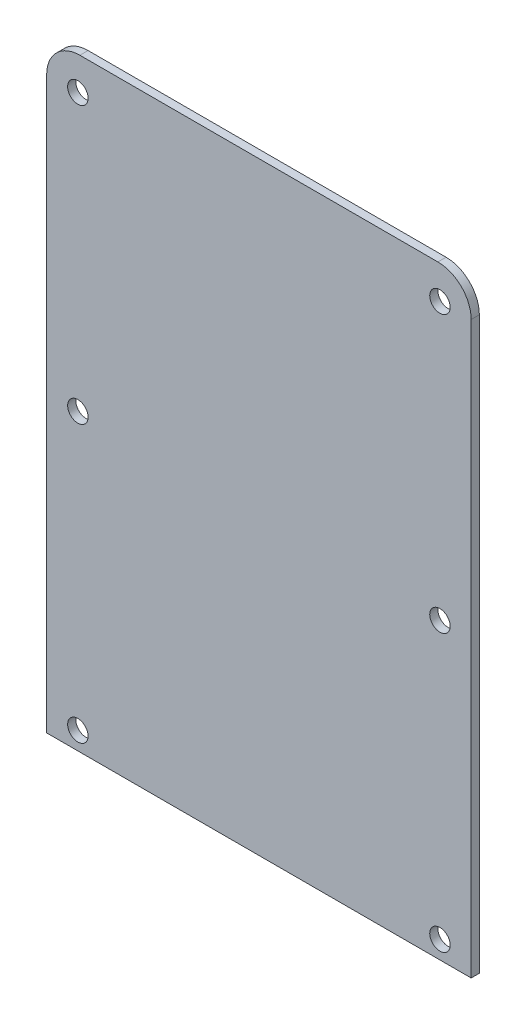
ISO-10303-21;
HEADER;
FILE_DESCRIPTION(('STEP AP214'),'2;1');
FILE_NAME('part.step','',(''),(''),'','','');
FILE_SCHEMA(('AUTOMOTIVE_DESIGN { 1 0 10303 214 1 1 1 1 }'));
ENDSEC;
DATA;
#1=APPLICATION_CONTEXT('core data for automotive mechanical design processes');
#2=APPLICATION_PROTOCOL_DEFINITION('international standard','automotive_design',2000,#1);
#3=PRODUCT_CONTEXT('',#1,'mechanical');
#4=PRODUCT('Part','Part','',(#3));
#5=PRODUCT_RELATED_PRODUCT_CATEGORY('part','',(#4));
#6=PRODUCT_DEFINITION_FORMATION('','',#4);
#7=PRODUCT_DEFINITION_CONTEXT('part definition',#1,'design');
#8=PRODUCT_DEFINITION('design','',#6,#7);
#9=PRODUCT_DEFINITION_SHAPE('','',#8);
#10=(LENGTH_UNIT() NAMED_UNIT(*) SI_UNIT(.MILLI.,.METRE.));
#11=(NAMED_UNIT(*) PLANE_ANGLE_UNIT() SI_UNIT($,.RADIAN.));
#12=(NAMED_UNIT(*) SI_UNIT($,.STERADIAN.) SOLID_ANGLE_UNIT());
#13=UNCERTAINTY_MEASURE_WITH_UNIT(LENGTH_MEASURE(1.E-05),#10,'distance_accuracy_value','');
#14=(GEOMETRIC_REPRESENTATION_CONTEXT(3) GLOBAL_UNCERTAINTY_ASSIGNED_CONTEXT((#13)) GLOBAL_UNIT_ASSIGNED_CONTEXT((#10,
#11,#12)) REPRESENTATION_CONTEXT('',''));
#15=CARTESIAN_POINT('',(0.,0.,0.));
#16=DIRECTION('',(0.,0.,1.));
#17=DIRECTION('',(1.,0.,0.));
#18=AXIS2_PLACEMENT_3D('',#15,#16,#17);
#19=CARTESIAN_POINT('',(-41.75,63.,0.8));
#20=DIRECTION('',(0.,0.,-1.));
#21=DIRECTION('',(-1.,0.,0.));
#22=AXIS2_PLACEMENT_3D('',#19,#20,#21);
#23=CYLINDRICAL_SURFACE('',#22,3.25);
#24=CARTESIAN_POINT('',(-41.75,63.,0.));
#25=DIRECTION('',(0.,0.,1.));
#26=DIRECTION('',(1.,0.,0.));
#27=AXIS2_PLACEMENT_3D('',#24,#25,#26);
#28=CIRCLE('',#27,3.25);
#29=CARTESIAN_POINT('',(-41.75,66.25,0.));
#30=VERTEX_POINT('',#29);
#31=CARTESIAN_POINT('',(-45.,63.,0.));
#32=VERTEX_POINT('',#31);
#33=EDGE_CURVE('E119',#30,#32,#28,.T.);
#34=ORIENTED_EDGE('',*,*,#33,.T.);
#35=DIRECTION('',(0.,0.,-1.));
#36=VECTOR('',#35,1.);
#37=CARTESIAN_POINT('',(-45.,63.,0.8));
#38=LINE('',#37,#36);
#39=CARTESIAN_POINT('',(-45.,63.,0.8));
#40=VERTEX_POINT('',#39);
#41=EDGE_CURVE('E11',#40,#32,#38,.T.);
#42=ORIENTED_EDGE('',*,*,#41,.F.);
#43=CARTESIAN_POINT('',(-41.75,63.,0.8));
#44=DIRECTION('',(0.,0.,1.));
#45=DIRECTION('',(1.,0.,0.));
#46=AXIS2_PLACEMENT_3D('',#43,#44,#45);
#47=CIRCLE('',#46,3.25);
#48=CARTESIAN_POINT('',(-41.75,66.25,0.8));
#49=VERTEX_POINT('',#48);
#50=EDGE_CURVE('E133',#49,#40,#47,.T.);
#51=ORIENTED_EDGE('',*,*,#50,.F.);
#52=DIRECTION('',(0.,0.,-1.));
#53=VECTOR('',#52,1.);
#54=CARTESIAN_POINT('',(-41.75,66.25,0.8));
#55=LINE('',#54,#53);
#56=EDGE_CURVE('E51',#49,#30,#55,.T.);
#57=ORIENTED_EDGE('',*,*,#56,.T.);
#58=EDGE_LOOP('',(#34,#42,#51,#57));
#59=FACE_BOUND('',#58,.T.);
#60=ADVANCED_FACE('F35',(#59),#23,.T.);
#61=CARTESIAN_POINT('',(-45.,63.,0.8));
#62=DIRECTION('',(1.,0.,0.));
#63=DIRECTION('',(0.,1.,0.));
#64=AXIS2_PLACEMENT_3D('',#61,#62,#63);
#65=PLANE('',#64);
#66=DIRECTION('',(0.,-1.,0.));
#67=VECTOR('',#66,1.);
#68=CARTESIAN_POINT('',(-45.,63.,0.));
#69=LINE('',#68,#67);
#70=CARTESIAN_POINT('',(-45.,7.25000000000001,0.));
#71=VERTEX_POINT('',#70);
#72=EDGE_CURVE('E121',#32,#71,#69,.T.);
#73=ORIENTED_EDGE('',*,*,#72,.T.);
#74=DIRECTION('',(0.,0.,-1.));
#75=VECTOR('',#74,1.);
#76=CARTESIAN_POINT('',(-45.,7.25000000000001,0.8));
#77=LINE('',#76,#75);
#78=CARTESIAN_POINT('',(-45.,7.25000000000001,0.8));
#79=VERTEX_POINT('',#78);
#80=EDGE_CURVE('E43',#79,#71,#77,.T.);
#81=ORIENTED_EDGE('',*,*,#80,.F.);
#82=DIRECTION('',(0.,-1.,0.));
#83=VECTOR('',#82,1.);
#84=CARTESIAN_POINT('',(-45.,63.,0.8));
#85=LINE('',#84,#83);
#86=EDGE_CURVE('E83',#40,#79,#85,.T.);
#87=ORIENTED_EDGE('',*,*,#86,.F.);
#88=ORIENTED_EDGE('',*,*,#41,.T.);
#89=EDGE_LOOP('',(#73,#81,#87,#88));
#90=FACE_BOUND('',#89,.T.);
#91=ADVANCED_FACE('F154',(#90),#65,.F.);
#92=CARTESIAN_POINT('',(-45.,7.25000000000001,0.8));
#93=DIRECTION('',(0.,1.,0.));
#94=DIRECTION('',(0.,0.,1.));
#95=AXIS2_PLACEMENT_3D('',#92,#93,#94);
#96=PLANE('',#95);
#97=DIRECTION('',(1.,0.,0.));
#98=VECTOR('',#97,1.);
#99=CARTESIAN_POINT('',(-45.,7.25000000000001,0.));
#100=LINE('',#99,#98);
#101=CARTESIAN_POINT('',(-3.49999999999999,7.25000000000001,0.));
#102=VERTEX_POINT('',#101);
#103=EDGE_CURVE('E124',#71,#102,#100,.T.);
#104=ORIENTED_EDGE('',*,*,#103,.T.);
#105=DIRECTION('',(0.,0.,-1.));
#106=VECTOR('',#105,1.);
#107=CARTESIAN_POINT('',(-3.49999999999999,7.25000000000001,0.8));
#108=LINE('',#107,#106);
#109=CARTESIAN_POINT('',(-3.49999999999999,7.25000000000001,0.8));
#110=VERTEX_POINT('',#109);
#111=EDGE_CURVE('E102',#110,#102,#108,.T.);
#112=ORIENTED_EDGE('',*,*,#111,.F.);
#113=DIRECTION('',(1.,0.,0.));
#114=VECTOR('',#113,1.);
#115=CARTESIAN_POINT('',(-45.,7.25000000000001,0.8));
#116=LINE('',#115,#114);
#117=EDGE_CURVE('E110',#79,#110,#116,.T.);
#118=ORIENTED_EDGE('',*,*,#117,.F.);
#119=ORIENTED_EDGE('',*,*,#80,.T.);
#120=EDGE_LOOP('',(#104,#112,#118,#119));
#121=FACE_BOUND('',#120,.T.);
#122=ADVANCED_FACE('F139',(#121),#96,.F.);
#123=CARTESIAN_POINT('',(-3.5,63.,0.8));
#124=DIRECTION('',(1.,0.,0.));
#125=DIRECTION('',(0.,1.,0.));
#126=AXIS2_PLACEMENT_3D('',#123,#124,#125);
#127=PLANE('',#126);
#128=DIRECTION('',(0.,-1.,0.));
#129=VECTOR('',#128,1.);
#130=CARTESIAN_POINT('',(-3.5,63.,0.));
#131=LINE('',#130,#129);
#132=CARTESIAN_POINT('',(-3.5,63.,0.));
#133=VERTEX_POINT('',#132);
#134=EDGE_CURVE('E98',#133,#102,#131,.T.);
#135=ORIENTED_EDGE('',*,*,#134,.F.);
#136=DIRECTION('',(0.,0.,-1.));
#137=VECTOR('',#136,1.);
#138=CARTESIAN_POINT('',(-3.5,63.,0.8));
#139=LINE('',#138,#137);
#140=CARTESIAN_POINT('',(-3.5,63.,0.8));
#141=VERTEX_POINT('',#140);
#142=EDGE_CURVE('E93',#141,#133,#139,.T.);
#143=ORIENTED_EDGE('',*,*,#142,.F.);
#144=DIRECTION('',(0.,-1.,0.));
#145=VECTOR('',#144,1.);
#146=CARTESIAN_POINT('',(-3.5,63.,0.8));
#147=LINE('',#146,#145);
#148=EDGE_CURVE('E96',#141,#110,#147,.T.);
#149=ORIENTED_EDGE('',*,*,#148,.T.);
#150=ORIENTED_EDGE('',*,*,#111,.T.);
#151=EDGE_LOOP('',(#135,#143,#149,#150));
#152=FACE_BOUND('',#151,.T.);
#153=ADVANCED_FACE('F95',(#152),#127,.T.);
#154=CARTESIAN_POINT('',(-6.75,63.,0.8));
#155=DIRECTION('',(0.,0.,-1.));
#156=DIRECTION('',(-1.,0.,0.));
#157=AXIS2_PLACEMENT_3D('',#154,#155,#156);
#158=CYLINDRICAL_SURFACE('',#157,3.24999999999999);
#159=CARTESIAN_POINT('',(-6.75,63.,0.));
#160=DIRECTION('',(0.,0.,-1.));
#161=DIRECTION('',(-1.,0.,0.));
#162=AXIS2_PLACEMENT_3D('',#159,#160,#161);
#163=CIRCLE('',#162,3.24999999999999);
#164=CARTESIAN_POINT('',(-6.75,66.25,0.));
#165=VERTEX_POINT('',#164);
#166=EDGE_CURVE('E128',#165,#133,#163,.T.);
#167=ORIENTED_EDGE('',*,*,#166,.F.);
#168=DIRECTION('',(0.,0.,-1.));
#169=VECTOR('',#168,1.);
#170=CARTESIAN_POINT('',(-6.75,66.25,0.8));
#171=LINE('',#170,#169);
#172=CARTESIAN_POINT('',(-6.75,66.25,0.8));
#173=VERTEX_POINT('',#172);
#174=EDGE_CURVE('E71',#173,#165,#171,.T.);
#175=ORIENTED_EDGE('',*,*,#174,.F.);
#176=CARTESIAN_POINT('',(-6.75,63.,0.8));
#177=DIRECTION('',(0.,0.,-1.));
#178=DIRECTION('',(-1.,0.,0.));
#179=AXIS2_PLACEMENT_3D('',#176,#177,#178);
#180=CIRCLE('',#179,3.24999999999999);
#181=EDGE_CURVE('E108',#173,#141,#180,.T.);
#182=ORIENTED_EDGE('',*,*,#181,.T.);
#183=ORIENTED_EDGE('',*,*,#142,.T.);
#184=EDGE_LOOP('',(#167,#175,#182,#183));
#185=FACE_BOUND('',#184,.T.);
#186=ADVANCED_FACE('F113',(#185),#158,.T.);
#187=CARTESIAN_POINT('',(-41.75,66.25,0.8));
#188=DIRECTION('',(0.,1.,0.));
#189=DIRECTION('',(0.,0.,1.));
#190=AXIS2_PLACEMENT_3D('',#187,#188,#189);
#191=PLANE('',#190);
#192=DIRECTION('',(1.,0.,0.));
#193=VECTOR('',#192,1.);
#194=CARTESIAN_POINT('',(-41.75,66.25,0.));
#195=LINE('',#194,#193);
#196=EDGE_CURVE('E130',#30,#165,#195,.T.);
#197=ORIENTED_EDGE('',*,*,#196,.F.);
#198=ORIENTED_EDGE('',*,*,#56,.F.);
#199=DIRECTION('',(1.,0.,0.));
#200=VECTOR('',#199,1.);
#201=CARTESIAN_POINT('',(-41.75,66.25,0.8));
#202=LINE('',#201,#200);
#203=EDGE_CURVE('E114',#49,#173,#202,.T.);
#204=ORIENTED_EDGE('',*,*,#203,.T.);
#205=ORIENTED_EDGE('',*,*,#174,.T.);
#206=EDGE_LOOP('',(#197,#198,#204,#205));
#207=FACE_BOUND('',#206,.T.);
#208=ADVANCED_FACE('F142',(#207),#191,.T.);
#209=CARTESIAN_POINT('',(-41.75,63.,0.8));
#210=DIRECTION('',(0.,0.,1.));
#211=DIRECTION('',(1.,0.,0.));
#212=AXIS2_PLACEMENT_3D('',#209,#210,#211);
#213=PLANE('',#212);
#214=CARTESIAN_POINT('',(-6.54999999999999,63.,0.8));
#215=DIRECTION('',(0.,0.,1.));
#216=DIRECTION('',(-1.,0.,0.));
#217=AXIS2_PLACEMENT_3D('',#214,#215,#216);
#218=CIRCLE('',#217,0.999999999999998);
#219=CARTESIAN_POINT('',(-7.54999999999999,63.,0.8));
#220=VERTEX_POINT('',#219);
#221=EDGE_CURVE('E168',#220,#220,#218,.T.);
#222=ORIENTED_EDGE('',*,*,#221,.F.);
#223=EDGE_LOOP('',(#222));
#224=FACE_BOUND('',#223,.T.);
#225=CARTESIAN_POINT('',(-6.55000000000028,36.,0.8));
#226=DIRECTION('',(0.,0.,1.));
#227=DIRECTION('',(-1.,0.,0.));
#228=AXIS2_PLACEMENT_3D('',#225,#226,#227);
#229=CIRCLE('',#228,0.999999999999998);
#230=CARTESIAN_POINT('',(-7.55000000000028,36.,0.8));
#231=VERTEX_POINT('',#230);
#232=EDGE_CURVE('E174',#231,#231,#229,.T.);
#233=ORIENTED_EDGE('',*,*,#232,.F.);
#234=EDGE_LOOP('',(#233));
#235=FACE_BOUND('',#234,.T.);
#236=CARTESIAN_POINT('',(-6.55000000000056,8.99999999999999,0.8));
#237=DIRECTION('',(0.,0.,1.));
#238=DIRECTION('',(-1.,0.,0.));
#239=AXIS2_PLACEMENT_3D('',#236,#237,#238);
#240=CIRCLE('',#239,0.999999999999998);
#241=CARTESIAN_POINT('',(-7.55000000000056,8.99999999999999,0.8));
#242=VERTEX_POINT('',#241);
#243=EDGE_CURVE('E180',#242,#242,#240,.T.);
#244=ORIENTED_EDGE('',*,*,#243,.F.);
#245=EDGE_LOOP('',(#244));
#246=FACE_BOUND('',#245,.T.);
#247=CARTESIAN_POINT('',(-41.9499999999994,8.99999999999999,0.8));
#248=DIRECTION('',(0.,0.,1.));
#249=DIRECTION('',(1.,0.,0.));
#250=AXIS2_PLACEMENT_3D('',#247,#248,#249);
#251=CIRCLE('',#250,0.999999999999998);
#252=CARTESIAN_POINT('',(-40.9499999999994,8.99999999999999,0.8));
#253=VERTEX_POINT('',#252);
#254=EDGE_CURVE('E186',#253,#253,#251,.T.);
#255=ORIENTED_EDGE('',*,*,#254,.F.);
#256=EDGE_LOOP('',(#255));
#257=FACE_BOUND('',#256,.T.);
#258=CARTESIAN_POINT('',(-41.9499999999997,36.,0.8));
#259=DIRECTION('',(0.,0.,1.));
#260=DIRECTION('',(1.,0.,0.));
#261=AXIS2_PLACEMENT_3D('',#258,#259,#260);
#262=CIRCLE('',#261,0.999999999999998);
#263=CARTESIAN_POINT('',(-40.9499999999997,36.,0.8));
#264=VERTEX_POINT('',#263);
#265=EDGE_CURVE('E192',#264,#264,#262,.T.);
#266=ORIENTED_EDGE('',*,*,#265,.F.);
#267=EDGE_LOOP('',(#266));
#268=FACE_BOUND('',#267,.T.);
#269=CARTESIAN_POINT('',(-41.95,63.,0.8));
#270=DIRECTION('',(0.,0.,1.));
#271=DIRECTION('',(1.,0.,0.));
#272=AXIS2_PLACEMENT_3D('',#269,#270,#271);
#273=CIRCLE('',#272,0.999999999999998);
#274=CARTESIAN_POINT('',(-40.95,63.,0.8));
#275=VERTEX_POINT('',#274);
#276=EDGE_CURVE('E162',#275,#275,#273,.T.);
#277=ORIENTED_EDGE('',*,*,#276,.F.);
#278=EDGE_LOOP('',(#277));
#279=FACE_BOUND('',#278,.T.);
#280=ORIENTED_EDGE('',*,*,#50,.T.);
#281=ORIENTED_EDGE('',*,*,#86,.T.);
#282=ORIENTED_EDGE('',*,*,#117,.T.);
#283=ORIENTED_EDGE('',*,*,#148,.F.);
#284=ORIENTED_EDGE('',*,*,#181,.F.);
#285=ORIENTED_EDGE('',*,*,#203,.F.);
#286=EDGE_LOOP('',(#280,#281,#282,#283,#284,#285));
#287=FACE_BOUND('',#286,.T.);
#288=ADVANCED_FACE('F106',(#224,#235,#246,#257,#268,#279,#287),#213,.T.);
#289=CARTESIAN_POINT('',(-41.75,63.,0.));
#290=DIRECTION('',(0.,0.,1.));
#291=DIRECTION('',(1.,0.,0.));
#292=AXIS2_PLACEMENT_3D('',#289,#290,#291);
#293=PLANE('',#292);
#294=CARTESIAN_POINT('',(-6.54999999999999,63.,0.));
#295=DIRECTION('',(0.,0.,1.));
#296=DIRECTION('',(-1.,0.,0.));
#297=AXIS2_PLACEMENT_3D('',#294,#295,#296);
#298=CIRCLE('',#297,0.999999999999998);
#299=CARTESIAN_POINT('',(-7.54999999999999,63.,0.));
#300=VERTEX_POINT('',#299);
#301=EDGE_CURVE('E171',#300,#300,#298,.T.);
#302=ORIENTED_EDGE('',*,*,#301,.T.);
#303=EDGE_LOOP('',(#302));
#304=FACE_BOUND('',#303,.T.);
#305=CARTESIAN_POINT('',(-6.55000000000028,36.,0.));
#306=DIRECTION('',(0.,0.,1.));
#307=DIRECTION('',(-1.,0.,0.));
#308=AXIS2_PLACEMENT_3D('',#305,#306,#307);
#309=CIRCLE('',#308,0.999999999999998);
#310=CARTESIAN_POINT('',(-7.55000000000028,36.,0.));
#311=VERTEX_POINT('',#310);
#312=EDGE_CURVE('E177',#311,#311,#309,.T.);
#313=ORIENTED_EDGE('',*,*,#312,.T.);
#314=EDGE_LOOP('',(#313));
#315=FACE_BOUND('',#314,.T.);
#316=CARTESIAN_POINT('',(-6.55000000000056,8.99999999999999,0.));
#317=DIRECTION('',(0.,0.,1.));
#318=DIRECTION('',(-1.,0.,0.));
#319=AXIS2_PLACEMENT_3D('',#316,#317,#318);
#320=CIRCLE('',#319,0.999999999999998);
#321=CARTESIAN_POINT('',(-7.55000000000056,8.99999999999999,0.));
#322=VERTEX_POINT('',#321);
#323=EDGE_CURVE('E183',#322,#322,#320,.T.);
#324=ORIENTED_EDGE('',*,*,#323,.T.);
#325=EDGE_LOOP('',(#324));
#326=FACE_BOUND('',#325,.T.);
#327=CARTESIAN_POINT('',(-41.9499999999994,8.99999999999999,0.));
#328=DIRECTION('',(0.,0.,1.));
#329=DIRECTION('',(1.,0.,0.));
#330=AXIS2_PLACEMENT_3D('',#327,#328,#329);
#331=CIRCLE('',#330,0.999999999999998);
#332=CARTESIAN_POINT('',(-40.9499999999994,8.99999999999999,0.));
#333=VERTEX_POINT('',#332);
#334=EDGE_CURVE('E189',#333,#333,#331,.T.);
#335=ORIENTED_EDGE('',*,*,#334,.T.);
#336=EDGE_LOOP('',(#335));
#337=FACE_BOUND('',#336,.T.);
#338=CARTESIAN_POINT('',(-41.9499999999997,36.,0.));
#339=DIRECTION('',(0.,0.,1.));
#340=DIRECTION('',(1.,0.,0.));
#341=AXIS2_PLACEMENT_3D('',#338,#339,#340);
#342=CIRCLE('',#341,0.999999999999998);
#343=CARTESIAN_POINT('',(-40.9499999999997,36.,0.));
#344=VERTEX_POINT('',#343);
#345=EDGE_CURVE('E165',#344,#344,#342,.T.);
#346=ORIENTED_EDGE('',*,*,#345,.T.);
#347=EDGE_LOOP('',(#346));
#348=FACE_BOUND('',#347,.T.);
#349=CARTESIAN_POINT('',(-41.95,63.,0.));
#350=DIRECTION('',(0.,0.,1.));
#351=DIRECTION('',(1.,0.,0.));
#352=AXIS2_PLACEMENT_3D('',#349,#350,#351);
#353=CIRCLE('',#352,0.999999999999998);
#354=CARTESIAN_POINT('',(-40.95,63.,0.));
#355=VERTEX_POINT('',#354);
#356=EDGE_CURVE('E122',#355,#355,#353,.T.);
#357=ORIENTED_EDGE('',*,*,#356,.T.);
#358=EDGE_LOOP('',(#357));
#359=FACE_BOUND('',#358,.T.);
#360=ORIENTED_EDGE('',*,*,#33,.F.);
#361=ORIENTED_EDGE('',*,*,#196,.T.);
#362=ORIENTED_EDGE('',*,*,#166,.T.);
#363=ORIENTED_EDGE('',*,*,#134,.T.);
#364=ORIENTED_EDGE('',*,*,#103,.F.);
#365=ORIENTED_EDGE('',*,*,#72,.F.);
#366=EDGE_LOOP('',(#360,#361,#362,#363,#364,#365));
#367=FACE_BOUND('',#366,.T.);
#368=ADVANCED_FACE('F141',(#304,#315,#326,#337,#348,#359,#367),#293,.F.);
#369=CARTESIAN_POINT('',(-41.95,63.,0.));
#370=DIRECTION('',(0.,0.,1.));
#371=DIRECTION('',(1.,0.,0.));
#372=AXIS2_PLACEMENT_3D('',#369,#370,#371);
#373=CYLINDRICAL_SURFACE('',#372,0.999999999999998);
#374=ORIENTED_EDGE('',*,*,#356,.F.);
#375=EDGE_LOOP('',(#374));
#376=FACE_BOUND('',#375,.T.);
#377=ORIENTED_EDGE('',*,*,#276,.T.);
#378=EDGE_LOOP('',(#377));
#379=FACE_BOUND('',#378,.T.);
#380=ADVANCED_FACE('F204',(#376,#379),#373,.F.);
#381=CARTESIAN_POINT('',(-41.9499999999997,36.,0.));
#382=DIRECTION('',(0.,0.,1.));
#383=DIRECTION('',(1.,0.,0.));
#384=AXIS2_PLACEMENT_3D('',#381,#382,#383);
#385=CYLINDRICAL_SURFACE('',#384,0.999999999999998);
#386=ORIENTED_EDGE('',*,*,#345,.F.);
#387=EDGE_LOOP('',(#386));
#388=FACE_BOUND('',#387,.T.);
#389=ORIENTED_EDGE('',*,*,#265,.T.);
#390=EDGE_LOOP('',(#389));
#391=FACE_BOUND('',#390,.T.);
#392=ADVANCED_FACE('F200',(#388,#391),#385,.F.);
#393=CARTESIAN_POINT('',(-41.9499999999994,8.99999999999999,0.));
#394=DIRECTION('',(0.,0.,1.));
#395=DIRECTION('',(1.,0.,0.));
#396=AXIS2_PLACEMENT_3D('',#393,#394,#395);
#397=CYLINDRICAL_SURFACE('',#396,0.999999999999998);
#398=ORIENTED_EDGE('',*,*,#334,.F.);
#399=EDGE_LOOP('',(#398));
#400=FACE_BOUND('',#399,.T.);
#401=ORIENTED_EDGE('',*,*,#254,.T.);
#402=EDGE_LOOP('',(#401));
#403=FACE_BOUND('',#402,.T.);
#404=ADVANCED_FACE('F203',(#400,#403),#397,.F.);
#405=CARTESIAN_POINT('',(-6.55000000000056,8.99999999999999,0.));
#406=DIRECTION('',(0.,0.,1.));
#407=DIRECTION('',(1.,0.,0.));
#408=AXIS2_PLACEMENT_3D('',#405,#406,#407);
#409=CYLINDRICAL_SURFACE('',#408,0.999999999999998);
#410=ORIENTED_EDGE('',*,*,#323,.F.);
#411=EDGE_LOOP('',(#410));
#412=FACE_BOUND('',#411,.T.);
#413=ORIENTED_EDGE('',*,*,#243,.T.);
#414=EDGE_LOOP('',(#413));
#415=FACE_BOUND('',#414,.T.);
#416=ADVANCED_FACE('F227',(#412,#415),#409,.F.);
#417=CARTESIAN_POINT('',(-6.55000000000028,36.,0.));
#418=DIRECTION('',(0.,0.,1.));
#419=DIRECTION('',(1.,0.,0.));
#420=AXIS2_PLACEMENT_3D('',#417,#418,#419);
#421=CYLINDRICAL_SURFACE('',#420,0.999999999999998);
#422=ORIENTED_EDGE('',*,*,#312,.F.);
#423=EDGE_LOOP('',(#422));
#424=FACE_BOUND('',#423,.T.);
#425=ORIENTED_EDGE('',*,*,#232,.T.);
#426=EDGE_LOOP('',(#425));
#427=FACE_BOUND('',#426,.T.);
#428=ADVANCED_FACE('F223',(#424,#427),#421,.F.);
#429=CARTESIAN_POINT('',(-6.54999999999999,63.,0.));
#430=DIRECTION('',(0.,0.,1.));
#431=DIRECTION('',(1.,0.,0.));
#432=AXIS2_PLACEMENT_3D('',#429,#430,#431);
#433=CYLINDRICAL_SURFACE('',#432,0.999999999999998);
#434=ORIENTED_EDGE('',*,*,#301,.F.);
#435=EDGE_LOOP('',(#434));
#436=FACE_BOUND('',#435,.T.);
#437=ORIENTED_EDGE('',*,*,#221,.T.);
#438=EDGE_LOOP('',(#437));
#439=FACE_BOUND('',#438,.T.);
#440=ADVANCED_FACE('F220',(#436,#439),#433,.F.);
#441=CLOSED_SHELL('',(#60,#91,#122,#153,#186,#208,#288,#368,#380,#392,#404,#416,#428,#440));
#442=MANIFOLD_SOLID_BREP('B2',#441);
#443=ADVANCED_BREP_SHAPE_REPRESENTATION('',(#18,#442),#14);
#444=SHAPE_DEFINITION_REPRESENTATION(#9,#443);
ENDSEC;
END-ISO-10303-21;
